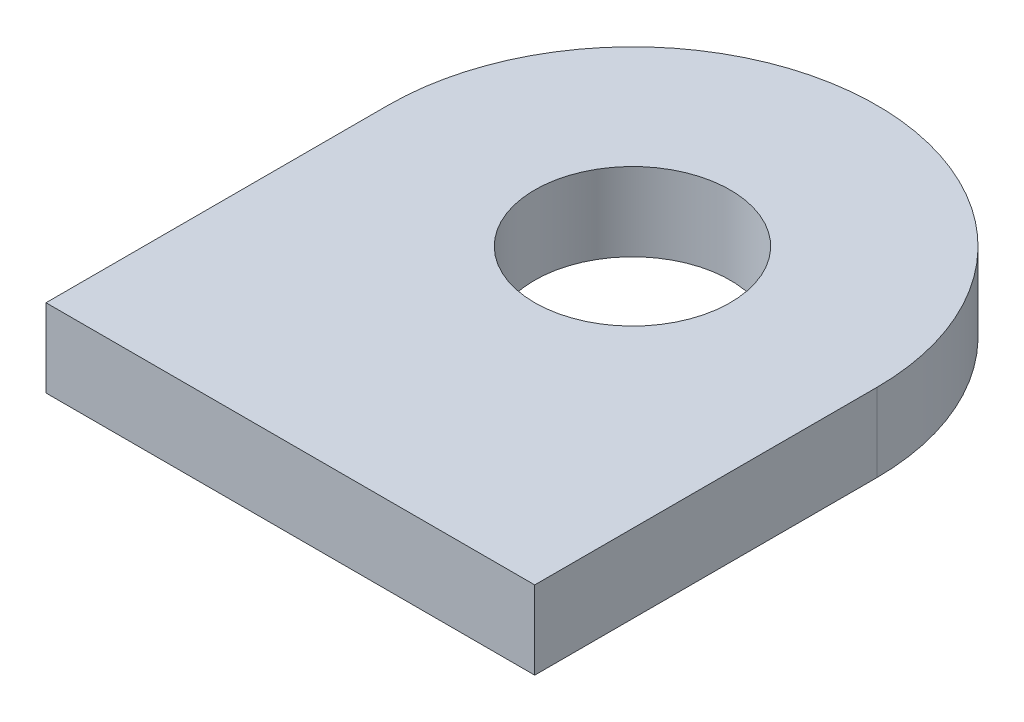
ISO-10303-21;
HEADER;
FILE_DESCRIPTION(('STEP AP214'),'2;1');
FILE_NAME('part.step','',(''),(''),'','','');
FILE_SCHEMA(('AUTOMOTIVE_DESIGN { 1 0 10303 214 1 1 1 1 }'));
ENDSEC;
DATA;
#1=APPLICATION_CONTEXT('core data for automotive mechanical design processes');
#2=APPLICATION_PROTOCOL_DEFINITION('international standard','automotive_design',2000,#1);
#3=PRODUCT_CONTEXT('',#1,'mechanical');
#4=PRODUCT('Part','Part','',(#3));
#5=PRODUCT_RELATED_PRODUCT_CATEGORY('part','',(#4));
#6=PRODUCT_DEFINITION_FORMATION('','',#4);
#7=PRODUCT_DEFINITION_CONTEXT('part definition',#1,'design');
#8=PRODUCT_DEFINITION('design','',#6,#7);
#9=PRODUCT_DEFINITION_SHAPE('','',#8);
#10=(LENGTH_UNIT() NAMED_UNIT(*) SI_UNIT(.MILLI.,.METRE.));
#11=(NAMED_UNIT(*) PLANE_ANGLE_UNIT() SI_UNIT($,.RADIAN.));
#12=(NAMED_UNIT(*) SI_UNIT($,.STERADIAN.) SOLID_ANGLE_UNIT());
#13=UNCERTAINTY_MEASURE_WITH_UNIT(LENGTH_MEASURE(1.E-05),#10,'distance_accuracy_value','');
#14=(GEOMETRIC_REPRESENTATION_CONTEXT(3) GLOBAL_UNCERTAINTY_ASSIGNED_CONTEXT((#13)) GLOBAL_UNIT_ASSIGNED_CONTEXT((#10,
#11,#12)) REPRESENTATION_CONTEXT('',''));
#15=CARTESIAN_POINT('',(0.,0.,0.));
#16=DIRECTION('',(0.,0.,1.));
#17=DIRECTION('',(1.,0.,0.));
#18=AXIS2_PLACEMENT_3D('',#15,#16,#17);
#19=CARTESIAN_POINT('',(-7.9375,2.54,0.));
#20=DIRECTION('',(1.,0.,0.));
#21=DIRECTION('',(0.,0.,-1.));
#22=AXIS2_PLACEMENT_3D('',#19,#20,#21);
#23=PLANE('',#22);
#24=DIRECTION('',(0.,0.,1.));
#25=VECTOR('',#24,1.);
#26=CARTESIAN_POINT('',(-7.9375,0.,0.));
#27=LINE('',#26,#25);
#28=CARTESIAN_POINT('',(-7.9375,0.,0.));
#29=VERTEX_POINT('',#28);
#30=CARTESIAN_POINT('',(-7.9375,0.,11.1125));
#31=VERTEX_POINT('',#30);
#32=EDGE_CURVE('E98',#29,#31,#27,.T.);
#33=ORIENTED_EDGE('',*,*,#32,.T.);
#34=DIRECTION('',(0.,-1.,0.));
#35=VECTOR('',#34,1.);
#36=CARTESIAN_POINT('',(-7.9375,2.54,11.1125));
#37=LINE('',#36,#35);
#38=CARTESIAN_POINT('',(-7.9375,2.54,11.1125));
#39=VERTEX_POINT('',#38);
#40=EDGE_CURVE('E11',#39,#31,#37,.T.);
#41=ORIENTED_EDGE('',*,*,#40,.F.);
#42=DIRECTION('',(0.,0.,1.));
#43=VECTOR('',#42,1.);
#44=CARTESIAN_POINT('',(-7.9375,2.54,0.));
#45=LINE('',#44,#43);
#46=CARTESIAN_POINT('',(-7.9375,2.54,0.));
#47=VERTEX_POINT('',#46);
#48=EDGE_CURVE('E86',#47,#39,#45,.T.);
#49=ORIENTED_EDGE('',*,*,#48,.F.);
#50=DIRECTION('',(0.,-1.,0.));
#51=VECTOR('',#50,1.);
#52=CARTESIAN_POINT('',(-7.9375,2.54,0.));
#53=LINE('',#52,#51);
#54=EDGE_CURVE('E94',#47,#29,#53,.T.);
#55=ORIENTED_EDGE('',*,*,#54,.T.);
#56=EDGE_LOOP('',(#33,#41,#49,#55));
#57=FACE_BOUND('',#56,.T.);
#58=ADVANCED_FACE('F35',(#57),#23,.F.);
#59=CARTESIAN_POINT('',(-7.9375,2.54,11.1125));
#60=DIRECTION('',(0.,0.,-1.));
#61=DIRECTION('',(-1.,0.,0.));
#62=AXIS2_PLACEMENT_3D('',#59,#60,#61);
#63=PLANE('',#62);
#64=DIRECTION('',(1.,0.,0.));
#65=VECTOR('',#64,1.);
#66=CARTESIAN_POINT('',(-7.9375,0.,11.1125));
#67=LINE('',#66,#65);
#68=CARTESIAN_POINT('',(7.9375,0.,11.1125));
#69=VERTEX_POINT('',#68);
#70=EDGE_CURVE('E90',#31,#69,#67,.T.);
#71=ORIENTED_EDGE('',*,*,#70,.T.);
#72=DIRECTION('',(0.,-1.,0.));
#73=VECTOR('',#72,1.);
#74=CARTESIAN_POINT('',(7.9375,2.54,11.1125));
#75=LINE('',#74,#73);
#76=CARTESIAN_POINT('',(7.9375,2.54,11.1125));
#77=VERTEX_POINT('',#76);
#78=EDGE_CURVE('E43',#77,#69,#75,.T.);
#79=ORIENTED_EDGE('',*,*,#78,.F.);
#80=DIRECTION('',(1.,0.,0.));
#81=VECTOR('',#80,1.);
#82=CARTESIAN_POINT('',(-7.9375,2.54,11.1125));
#83=LINE('',#82,#81);
#84=EDGE_CURVE('E81',#39,#77,#83,.T.);
#85=ORIENTED_EDGE('',*,*,#84,.F.);
#86=ORIENTED_EDGE('',*,*,#40,.T.);
#87=EDGE_LOOP('',(#71,#79,#85,#86));
#88=FACE_BOUND('',#87,.T.);
#89=ADVANCED_FACE('F89',(#88),#63,.F.);
#90=CARTESIAN_POINT('',(7.9375,2.54,11.1125));
#91=DIRECTION('',(-1.,0.,0.));
#92=DIRECTION('',(0.,0.,1.));
#93=AXIS2_PLACEMENT_3D('',#90,#91,#92);
#94=PLANE('',#93);
#95=DIRECTION('',(0.,0.,-1.));
#96=VECTOR('',#95,1.);
#97=CARTESIAN_POINT('',(7.9375,0.,11.1125));
#98=LINE('',#97,#96);
#99=CARTESIAN_POINT('',(7.9375,0.,0.));
#100=VERTEX_POINT('',#99);
#101=EDGE_CURVE('E68',#69,#100,#98,.T.);
#102=ORIENTED_EDGE('',*,*,#101,.T.);
#103=DIRECTION('',(0.,-1.,0.));
#104=VECTOR('',#103,1.);
#105=CARTESIAN_POINT('',(7.9375,2.54,0.));
#106=LINE('',#105,#104);
#107=CARTESIAN_POINT('',(7.9375,2.54,0.));
#108=VERTEX_POINT('',#107);
#109=EDGE_CURVE('E91',#108,#100,#106,.T.);
#110=ORIENTED_EDGE('',*,*,#109,.F.);
#111=DIRECTION('',(0.,0.,-1.));
#112=VECTOR('',#111,1.);
#113=CARTESIAN_POINT('',(7.9375,2.54,11.1125));
#114=LINE('',#113,#112);
#115=EDGE_CURVE('E84',#77,#108,#114,.T.);
#116=ORIENTED_EDGE('',*,*,#115,.F.);
#117=ORIENTED_EDGE('',*,*,#78,.T.);
#118=EDGE_LOOP('',(#102,#110,#116,#117));
#119=FACE_BOUND('',#118,.T.);
#120=ADVANCED_FACE('F92',(#119),#94,.F.);
#121=CARTESIAN_POINT('',(0.,2.54,0.));
#122=DIRECTION('',(0.,-1.,0.));
#123=DIRECTION('',(0.,0.,-1.));
#124=AXIS2_PLACEMENT_3D('',#121,#122,#123);
#125=CYLINDRICAL_SURFACE('',#124,7.9375);
#126=CARTESIAN_POINT('',(0.,0.,0.));
#127=DIRECTION('',(0.,1.,0.));
#128=DIRECTION('',(0.,0.,1.));
#129=AXIS2_PLACEMENT_3D('',#126,#127,#128);
#130=CIRCLE('',#129,7.9375);
#131=EDGE_CURVE('E74',#100,#29,#130,.T.);
#132=ORIENTED_EDGE('',*,*,#131,.T.);
#133=ORIENTED_EDGE('',*,*,#54,.F.);
#134=CARTESIAN_POINT('',(0.,2.54,0.));
#135=DIRECTION('',(0.,1.,0.));
#136=DIRECTION('',(0.,0.,1.));
#137=AXIS2_PLACEMENT_3D('',#134,#135,#136);
#138=CIRCLE('',#137,7.9375);
#139=EDGE_CURVE('E51',#108,#47,#138,.T.);
#140=ORIENTED_EDGE('',*,*,#139,.F.);
#141=ORIENTED_EDGE('',*,*,#109,.T.);
#142=EDGE_LOOP('',(#132,#133,#140,#141));
#143=FACE_BOUND('',#142,.T.);
#144=ADVANCED_FACE('F106',(#143),#125,.T.);
#145=CARTESIAN_POINT('',(0.,2.54,0.));
#146=DIRECTION('',(0.,1.,0.));
#147=DIRECTION('',(0.,0.,1.));
#148=AXIS2_PLACEMENT_3D('',#145,#146,#147);
#149=PLANE('',#148);
#150=CARTESIAN_POINT('',(0.,2.54,0.));
#151=DIRECTION('',(0.,1.,0.));
#152=DIRECTION('',(0.,0.,1.));
#153=AXIS2_PLACEMENT_3D('',#150,#151,#152);
#154=CIRCLE('',#153,3.175);
#155=CARTESIAN_POINT('',(0.,2.54,3.175));
#156=VERTEX_POINT('',#155);
#157=EDGE_CURVE('E114',#156,#156,#154,.T.);
#158=ORIENTED_EDGE('',*,*,#157,.F.);
#159=EDGE_LOOP('',(#158));
#160=FACE_BOUND('',#159,.T.);
#161=ORIENTED_EDGE('',*,*,#48,.T.);
#162=ORIENTED_EDGE('',*,*,#84,.T.);
#163=ORIENTED_EDGE('',*,*,#115,.T.);
#164=ORIENTED_EDGE('',*,*,#139,.T.);
#165=EDGE_LOOP('',(#161,#162,#163,#164));
#166=FACE_BOUND('',#165,.T.);
#167=ADVANCED_FACE('F82',(#160,#166),#149,.T.);
#168=CARTESIAN_POINT('',(0.,0.,0.));
#169=DIRECTION('',(0.,1.,0.));
#170=DIRECTION('',(0.,0.,1.));
#171=AXIS2_PLACEMENT_3D('',#168,#169,#170);
#172=PLANE('',#171);
#173=CARTESIAN_POINT('',(0.,0.,0.));
#174=DIRECTION('',(0.,1.,0.));
#175=DIRECTION('',(0.,0.,1.));
#176=AXIS2_PLACEMENT_3D('',#173,#174,#175);
#177=CIRCLE('',#176,3.175);
#178=CARTESIAN_POINT('',(0.,0.,3.175));
#179=VERTEX_POINT('',#178);
#180=EDGE_CURVE('E101',#179,#179,#177,.T.);
#181=ORIENTED_EDGE('',*,*,#180,.T.);
#182=EDGE_LOOP('',(#181));
#183=FACE_BOUND('',#182,.T.);
#184=ORIENTED_EDGE('',*,*,#32,.F.);
#185=ORIENTED_EDGE('',*,*,#131,.F.);
#186=ORIENTED_EDGE('',*,*,#101,.F.);
#187=ORIENTED_EDGE('',*,*,#70,.F.);
#188=EDGE_LOOP('',(#184,#185,#186,#187));
#189=FACE_BOUND('',#188,.T.);
#190=ADVANCED_FACE('F109',(#183,#189),#172,.F.);
#191=CARTESIAN_POINT('',(0.,2.54,0.));
#192=DIRECTION('',(0.,1.,0.));
#193=DIRECTION('',(0.,0.,1.));
#194=AXIS2_PLACEMENT_3D('',#191,#192,#193);
#195=CYLINDRICAL_SURFACE('',#194,3.175);
#196=ORIENTED_EDGE('',*,*,#180,.F.);
#197=EDGE_LOOP('',(#196));
#198=FACE_BOUND('',#197,.T.);
#199=ORIENTED_EDGE('',*,*,#157,.T.);
#200=EDGE_LOOP('',(#199));
#201=FACE_BOUND('',#200,.T.);
#202=ADVANCED_FACE('F118',(#198,#201),#195,.F.);
#203=CLOSED_SHELL('',(#58,#89,#120,#144,#167,#190,#202));
#204=MANIFOLD_SOLID_BREP('B2',#203);
#205=ADVANCED_BREP_SHAPE_REPRESENTATION('',(#18,#204),#14);
#206=SHAPE_DEFINITION_REPRESENTATION(#9,#205);
ENDSEC;
END-ISO-10303-21;
